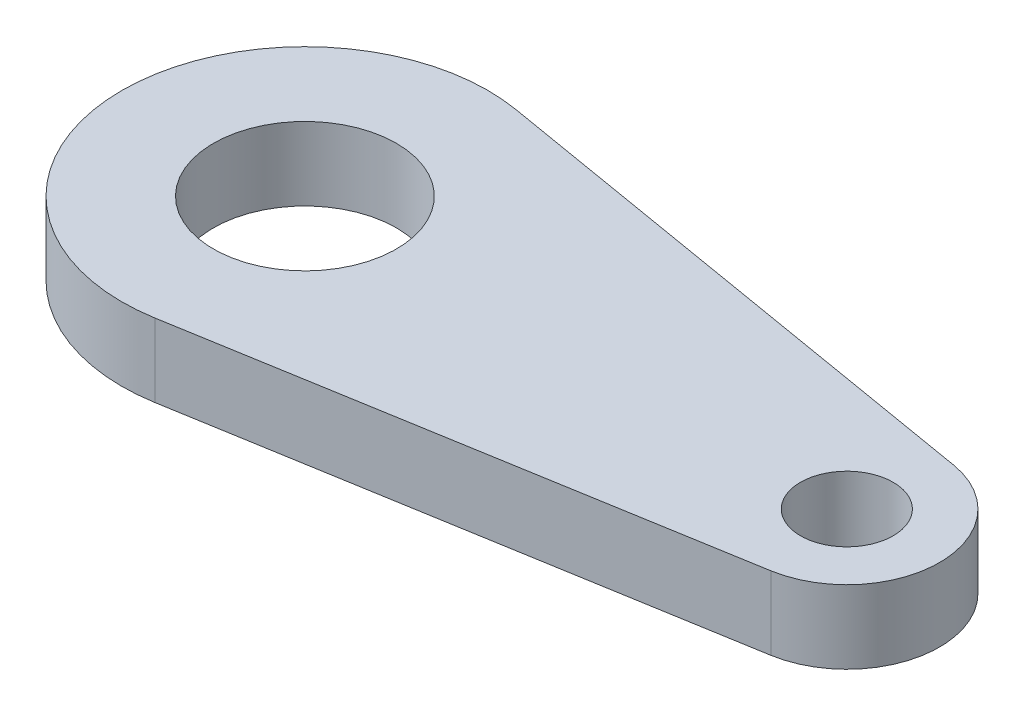
ISO-10303-21;
HEADER;
FILE_DESCRIPTION(('STEP AP214'),'2;1');
FILE_NAME('part.step','',(''),(''),'','','');
FILE_SCHEMA(('AUTOMOTIVE_DESIGN { 1 0 10303 214 1 1 1 1 }'));
ENDSEC;
DATA;
#1=APPLICATION_CONTEXT('core data for automotive mechanical design processes');
#2=APPLICATION_PROTOCOL_DEFINITION('international standard','automotive_design',2000,#1);
#3=PRODUCT_CONTEXT('',#1,'mechanical');
#4=PRODUCT('Part','Part','',(#3));
#5=PRODUCT_RELATED_PRODUCT_CATEGORY('part','',(#4));
#6=PRODUCT_DEFINITION_FORMATION('','',#4);
#7=PRODUCT_DEFINITION_CONTEXT('part definition',#1,'design');
#8=PRODUCT_DEFINITION('design','',#6,#7);
#9=PRODUCT_DEFINITION_SHAPE('','',#8);
#10=(LENGTH_UNIT() NAMED_UNIT(*) SI_UNIT(.MILLI.,.METRE.));
#11=(NAMED_UNIT(*) PLANE_ANGLE_UNIT() SI_UNIT($,.RADIAN.));
#12=(NAMED_UNIT(*) SI_UNIT($,.STERADIAN.) SOLID_ANGLE_UNIT());
#13=UNCERTAINTY_MEASURE_WITH_UNIT(LENGTH_MEASURE(1.E-05),#10,'distance_accuracy_value','');
#14=(GEOMETRIC_REPRESENTATION_CONTEXT(3) GLOBAL_UNCERTAINTY_ASSIGNED_CONTEXT((#13)) GLOBAL_UNIT_ASSIGNED_CONTEXT((#10,
#11,#12)) REPRESENTATION_CONTEXT('',''));
#15=CARTESIAN_POINT('',(0.,0.,0.));
#16=DIRECTION('',(0.,0.,1.));
#17=DIRECTION('',(1.,0.,0.));
#18=AXIS2_PLACEMENT_3D('',#15,#16,#17);
#19=CARTESIAN_POINT('',(-56.388,7.62,0.));
#20=DIRECTION('',(0.,1.,0.));
#21=DIRECTION('',(0.,0.,1.));
#22=AXIS2_PLACEMENT_3D('',#19,#20,#21);
#23=PLANE('',#22);
#24=CARTESIAN_POINT('',(-56.388,7.62,0.));
#25=DIRECTION('',(0.,1.,0.));
#26=DIRECTION('',(0.,0.,1.));
#27=AXIS2_PLACEMENT_3D('',#24,#25,#26);
#28=CIRCLE('',#27,9.525);
#29=CARTESIAN_POINT('',(-56.388,7.62,-9.525));
#30=VERTEX_POINT('',#29);
#31=EDGE_CURVE('E104',#30,#30,#28,.T.);
#32=ORIENTED_EDGE('',*,*,#31,.F.);
#33=EDGE_LOOP('',(#32));
#34=FACE_BOUND('',#33,.T.);
#35=CARTESIAN_POINT('',(-56.388,7.62,0.));
#36=DIRECTION('',(0.,1.,0.));
#37=DIRECTION('',(0.,0.,1.));
#38=AXIS2_PLACEMENT_3D('',#35,#36,#37);
#39=CIRCLE('',#38,19.05);
#40=CARTESIAN_POINT('',(-53.213,7.62,-18.7835533113413));
#41=VERTEX_POINT('',#40);
#42=CARTESIAN_POINT('',(-53.213,7.62,18.7835533113413));
#43=VERTEX_POINT('',#42);
#44=EDGE_CURVE('E89',#41,#43,#39,.T.);
#45=ORIENTED_EDGE('',*,*,#44,.T.);
#46=DIRECTION('',(0.986013297183269,0.,-0.166666666666667));
#47=VECTOR('',#46,1.);
#48=CARTESIAN_POINT('',(-53.213,7.62,18.7835533113413));
#49=LINE('',#48,#47);
#50=CARTESIAN_POINT('',(1.60866666666667,7.62,9.51700034441291));
#51=VERTEX_POINT('',#50);
#52=EDGE_CURVE('E84',#43,#51,#49,.T.);
#53=ORIENTED_EDGE('',*,*,#52,.T.);
#54=CARTESIAN_POINT('',(0.,7.62,0.));
#55=DIRECTION('',(0.,1.,0.));
#56=DIRECTION('',(0.,0.,1.));
#57=AXIS2_PLACEMENT_3D('',#54,#55,#56);
#58=CIRCLE('',#57,9.652);
#59=CARTESIAN_POINT('',(1.60866666666667,7.62,-9.51700034441291));
#60=VERTEX_POINT('',#59);
#61=EDGE_CURVE('E87',#51,#60,#58,.T.);
#62=ORIENTED_EDGE('',*,*,#61,.T.);
#63=DIRECTION('',(-0.986013297183269,0.,-0.166666666666667));
#64=VECTOR('',#63,1.);
#65=CARTESIAN_POINT('',(-53.213,7.62,-18.7835533113413));
#66=LINE('',#65,#64);
#67=EDGE_CURVE('E54',#60,#41,#66,.T.);
#68=ORIENTED_EDGE('',*,*,#67,.T.);
#69=EDGE_LOOP('',(#45,#53,#62,#68));
#70=FACE_BOUND('',#69,.T.);
#71=CARTESIAN_POINT('',(0.,7.62,0.));
#72=DIRECTION('',(0.,1.,0.));
#73=DIRECTION('',(0.,0.,1.));
#74=AXIS2_PLACEMENT_3D('',#71,#72,#73);
#75=CIRCLE('',#74,4.826);
#76=CARTESIAN_POINT('',(0.,7.62,-4.826));
#77=VERTEX_POINT('',#76);
#78=EDGE_CURVE('E119',#77,#77,#75,.T.);
#79=ORIENTED_EDGE('',*,*,#78,.F.);
#80=EDGE_LOOP('',(#79));
#81=FACE_BOUND('',#80,.T.);
#82=ADVANCED_FACE('F37',(#34,#70,#81),#23,.T.);
#83=CARTESIAN_POINT('',(-56.388,0.,0.));
#84=DIRECTION('',(0.,1.,0.));
#85=DIRECTION('',(0.,0.,1.));
#86=AXIS2_PLACEMENT_3D('',#83,#84,#85);
#87=PLANE('',#86);
#88=CARTESIAN_POINT('',(-56.388,0.,0.));
#89=DIRECTION('',(0.,1.,0.));
#90=DIRECTION('',(0.,0.,1.));
#91=AXIS2_PLACEMENT_3D('',#88,#89,#90);
#92=CIRCLE('',#91,19.05);
#93=CARTESIAN_POINT('',(-53.213,0.,-18.7835533113413));
#94=VERTEX_POINT('',#93);
#95=CARTESIAN_POINT('',(-53.213,0.,18.7835533113413));
#96=VERTEX_POINT('',#95);
#97=EDGE_CURVE('E101',#94,#96,#92,.T.);
#98=ORIENTED_EDGE('',*,*,#97,.F.);
#99=DIRECTION('',(-0.986013297183269,0.,-0.166666666666667));
#100=VECTOR('',#99,1.);
#101=CARTESIAN_POINT('',(-53.213,0.,-18.7835533113413));
#102=LINE('',#101,#100);
#103=CARTESIAN_POINT('',(1.60866666666667,0.,-9.51700034441291));
#104=VERTEX_POINT('',#103);
#105=EDGE_CURVE('E77',#104,#94,#102,.T.);
#106=ORIENTED_EDGE('',*,*,#105,.F.);
#107=CARTESIAN_POINT('',(0.,0.,0.));
#108=DIRECTION('',(0.,1.,0.));
#109=DIRECTION('',(0.,0.,1.));
#110=AXIS2_PLACEMENT_3D('',#107,#108,#109);
#111=CIRCLE('',#110,9.652);
#112=CARTESIAN_POINT('',(1.60866666666667,0.,9.51700034441291));
#113=VERTEX_POINT('',#112);
#114=EDGE_CURVE('E71',#113,#104,#111,.T.);
#115=ORIENTED_EDGE('',*,*,#114,.F.);
#116=DIRECTION('',(0.986013297183269,0.,-0.166666666666667));
#117=VECTOR('',#116,1.);
#118=CARTESIAN_POINT('',(-53.213,0.,18.7835533113413));
#119=LINE('',#118,#117);
#120=EDGE_CURVE('E93',#96,#113,#119,.T.);
#121=ORIENTED_EDGE('',*,*,#120,.F.);
#122=EDGE_LOOP('',(#98,#106,#115,#121));
#123=FACE_BOUND('',#122,.T.);
#124=CARTESIAN_POINT('',(-56.388,0.,0.));
#125=DIRECTION('',(0.,1.,0.));
#126=DIRECTION('',(0.,0.,1.));
#127=AXIS2_PLACEMENT_3D('',#124,#125,#126);
#128=CIRCLE('',#127,9.525);
#129=CARTESIAN_POINT('',(-56.388,0.,-9.525));
#130=VERTEX_POINT('',#129);
#131=EDGE_CURVE('E116',#130,#130,#128,.T.);
#132=ORIENTED_EDGE('',*,*,#131,.T.);
#133=EDGE_LOOP('',(#132));
#134=FACE_BOUND('',#133,.T.);
#135=CARTESIAN_POINT('',(0.,0.,0.));
#136=DIRECTION('',(0.,1.,0.));
#137=DIRECTION('',(0.,0.,1.));
#138=AXIS2_PLACEMENT_3D('',#135,#136,#137);
#139=CIRCLE('',#138,4.826);
#140=CARTESIAN_POINT('',(0.,0.,-4.826));
#141=VERTEX_POINT('',#140);
#142=EDGE_CURVE('E122',#141,#141,#139,.T.);
#143=ORIENTED_EDGE('',*,*,#142,.T.);
#144=EDGE_LOOP('',(#143));
#145=FACE_BOUND('',#144,.T.);
#146=ADVANCED_FACE('F112',(#123,#134,#145),#87,.F.);
#147=CARTESIAN_POINT('',(-56.388,7.62,0.));
#148=DIRECTION('',(0.,-1.,0.));
#149=DIRECTION('',(0.,0.,-1.));
#150=AXIS2_PLACEMENT_3D('',#147,#148,#149);
#151=CYLINDRICAL_SURFACE('',#150,19.05);
#152=ORIENTED_EDGE('',*,*,#97,.T.);
#153=DIRECTION('',(0.,-1.,0.));
#154=VECTOR('',#153,1.);
#155=CARTESIAN_POINT('',(-53.213,7.62,18.7835533113413));
#156=LINE('',#155,#154);
#157=EDGE_CURVE('E11',#43,#96,#156,.T.);
#158=ORIENTED_EDGE('',*,*,#157,.F.);
#159=ORIENTED_EDGE('',*,*,#44,.F.);
#160=DIRECTION('',(0.,-1.,0.));
#161=VECTOR('',#160,1.);
#162=CARTESIAN_POINT('',(-53.213,7.62,-18.7835533113413));
#163=LINE('',#162,#161);
#164=EDGE_CURVE('E97',#41,#94,#163,.T.);
#165=ORIENTED_EDGE('',*,*,#164,.T.);
#166=EDGE_LOOP('',(#152,#158,#159,#165));
#167=FACE_BOUND('',#166,.T.);
#168=ADVANCED_FACE('F39',(#167),#151,.T.);
#169=CARTESIAN_POINT('',(-53.213,7.62,18.7835533113413));
#170=DIRECTION('',(-0.166666666666667,0.,-0.986013297183269));
#171=DIRECTION('',(-0.986013297183269,0.,0.166666666666667));
#172=AXIS2_PLACEMENT_3D('',#169,#170,#171);
#173=PLANE('',#172);
#174=ORIENTED_EDGE('',*,*,#120,.T.);
#175=DIRECTION('',(0.,-1.,0.));
#176=VECTOR('',#175,1.);
#177=CARTESIAN_POINT('',(1.60866666666667,7.62,9.51700034441291));
#178=LINE('',#177,#176);
#179=EDGE_CURVE('E46',#51,#113,#178,.T.);
#180=ORIENTED_EDGE('',*,*,#179,.F.);
#181=ORIENTED_EDGE('',*,*,#52,.F.);
#182=ORIENTED_EDGE('',*,*,#157,.T.);
#183=EDGE_LOOP('',(#174,#180,#181,#182));
#184=FACE_BOUND('',#183,.T.);
#185=ADVANCED_FACE('F92',(#184),#173,.F.);
#186=CARTESIAN_POINT('',(0.,7.62,0.));
#187=DIRECTION('',(0.,-1.,0.));
#188=DIRECTION('',(0.,0.,-1.));
#189=AXIS2_PLACEMENT_3D('',#186,#187,#188);
#190=CYLINDRICAL_SURFACE('',#189,9.652);
#191=ORIENTED_EDGE('',*,*,#114,.T.);
#192=DIRECTION('',(0.,-1.,0.));
#193=VECTOR('',#192,1.);
#194=CARTESIAN_POINT('',(1.60866666666667,7.62,-9.51700034441291));
#195=LINE('',#194,#193);
#196=EDGE_CURVE('E94',#60,#104,#195,.T.);
#197=ORIENTED_EDGE('',*,*,#196,.F.);
#198=ORIENTED_EDGE('',*,*,#61,.F.);
#199=ORIENTED_EDGE('',*,*,#179,.T.);
#200=EDGE_LOOP('',(#191,#197,#198,#199));
#201=FACE_BOUND('',#200,.T.);
#202=ADVANCED_FACE('F95',(#201),#190,.T.);
#203=CARTESIAN_POINT('',(-53.213,7.62,-18.7835533113413));
#204=DIRECTION('',(-0.166666666666667,0.,0.986013297183269));
#205=DIRECTION('',(0.986013297183269,0.,0.166666666666667));
#206=AXIS2_PLACEMENT_3D('',#203,#204,#205);
#207=PLANE('',#206);
#208=ORIENTED_EDGE('',*,*,#105,.T.);
#209=ORIENTED_EDGE('',*,*,#164,.F.);
#210=ORIENTED_EDGE('',*,*,#67,.F.);
#211=ORIENTED_EDGE('',*,*,#196,.T.);
#212=EDGE_LOOP('',(#208,#209,#210,#211));
#213=FACE_BOUND('',#212,.T.);
#214=ADVANCED_FACE('F109',(#213),#207,.F.);
#215=CARTESIAN_POINT('',(-56.388,7.62,0.));
#216=DIRECTION('',(0.,-1.,0.));
#217=DIRECTION('',(0.,0.,-1.));
#218=AXIS2_PLACEMENT_3D('',#215,#216,#217);
#219=CYLINDRICAL_SURFACE('',#218,9.525);
#220=CARTESIAN_POINT('',(-56.388,7.62,-9.525));
#221=CARTESIAN_POINT('',(-56.388,7.540625,-9.525));
#222=CARTESIAN_POINT('',(-56.388,7.46125,-9.525));
#223=CARTESIAN_POINT('',(-56.388,7.3025,-9.525));
#224=CARTESIAN_POINT('',(-56.388,7.223125,-9.525));
#225=CARTESIAN_POINT('',(-56.388,7.064375,-9.525));
#226=CARTESIAN_POINT('',(-56.388,6.985,-9.525));
#227=CARTESIAN_POINT('',(-56.388,6.82625,-9.525));
#228=CARTESIAN_POINT('',(-56.388,6.746875,-9.525));
#229=CARTESIAN_POINT('',(-56.388,6.588125,-9.525));
#230=CARTESIAN_POINT('',(-56.388,6.50875,-9.525));
#231=CARTESIAN_POINT('',(-56.388,6.35,-9.525));
#232=CARTESIAN_POINT('',(-56.388,6.270625,-9.525));
#233=CARTESIAN_POINT('',(-56.388,6.111875,-9.525));
#234=CARTESIAN_POINT('',(-56.388,6.0325,-9.525));
#235=CARTESIAN_POINT('',(-56.388,5.87375,-9.525));
#236=CARTESIAN_POINT('',(-56.388,5.794375,-9.525));
#237=CARTESIAN_POINT('',(-56.388,5.635625,-9.525));
#238=CARTESIAN_POINT('',(-56.388,5.55625,-9.525));
#239=CARTESIAN_POINT('',(-56.388,5.3975,-9.525));
#240=CARTESIAN_POINT('',(-56.388,5.318125,-9.525));
#241=CARTESIAN_POINT('',(-56.388,5.159375,-9.525));
#242=CARTESIAN_POINT('',(-56.388,5.08,-9.525));
#243=CARTESIAN_POINT('',(-56.388,4.92125,-9.525));
#244=CARTESIAN_POINT('',(-56.388,4.841875,-9.525));
#245=CARTESIAN_POINT('',(-56.388,4.683125,-9.525));
#246=CARTESIAN_POINT('',(-56.388,4.60375,-9.525));
#247=CARTESIAN_POINT('',(-56.388,4.445,-9.525));
#248=CARTESIAN_POINT('',(-56.388,4.365625,-9.525));
#249=CARTESIAN_POINT('',(-56.388,4.206875,-9.525));
#250=CARTESIAN_POINT('',(-56.388,4.1275,-9.525));
#251=CARTESIAN_POINT('',(-56.388,3.96875,-9.525));
#252=CARTESIAN_POINT('',(-56.388,3.889375,-9.525));
#253=CARTESIAN_POINT('',(-56.388,3.730625,-9.525));
#254=CARTESIAN_POINT('',(-56.388,3.65125,-9.525));
#255=CARTESIAN_POINT('',(-56.388,3.4925,-9.525));
#256=CARTESIAN_POINT('',(-56.388,3.413125,-9.525));
#257=CARTESIAN_POINT('',(-56.388,3.254375,-9.525));
#258=CARTESIAN_POINT('',(-56.388,3.175,-9.525));
#259=CARTESIAN_POINT('',(-56.388,3.01625,-9.525));
#260=CARTESIAN_POINT('',(-56.388,2.936875,-9.525));
#261=CARTESIAN_POINT('',(-56.388,2.778125,-9.525));
#262=CARTESIAN_POINT('',(-56.388,2.69875,-9.525));
#263=CARTESIAN_POINT('',(-56.388,2.54,-9.525));
#264=CARTESIAN_POINT('',(-56.388,2.460625,-9.525));
#265=CARTESIAN_POINT('',(-56.388,2.301875,-9.525));
#266=CARTESIAN_POINT('',(-56.388,2.2225,-9.525));
#267=CARTESIAN_POINT('',(-56.388,2.06375,-9.525));
#268=CARTESIAN_POINT('',(-56.388,1.984375,-9.525));
#269=CARTESIAN_POINT('',(-56.388,1.825625,-9.525));
#270=CARTESIAN_POINT('',(-56.388,1.74625,-9.525));
#271=CARTESIAN_POINT('',(-56.388,1.5875,-9.525));
#272=CARTESIAN_POINT('',(-56.388,1.508125,-9.525));
#273=CARTESIAN_POINT('',(-56.388,1.349375,-9.525));
#274=CARTESIAN_POINT('',(-56.388,1.27,-9.525));
#275=CARTESIAN_POINT('',(-56.388,1.11125,-9.525));
#276=CARTESIAN_POINT('',(-56.388,1.031875,-9.525));
#277=CARTESIAN_POINT('',(-56.388,0.873125,-9.525));
#278=CARTESIAN_POINT('',(-56.388,0.79375,-9.525));
#279=CARTESIAN_POINT('',(-56.388,0.635,-9.525));
#280=CARTESIAN_POINT('',(-56.388,0.555625,-9.525));
#281=CARTESIAN_POINT('',(-56.388,0.396875,-9.525));
#282=CARTESIAN_POINT('',(-56.388,0.3175,-9.525));
#283=CARTESIAN_POINT('',(-56.388,0.15875,-9.525));
#284=CARTESIAN_POINT('',(-56.388,0.0793749999999999,-9.525));
#285=CARTESIAN_POINT('',(-56.388,0.,-9.525));
#286=B_SPLINE_CURVE_WITH_KNOTS('',3,(#220,#221,#222,#223,#224,#225,#226,#227,#228,#229,#230,
#231,#232,#233,#234,#235,#236,#237,#238,#239,#240,#241,#242,#243,#244,#245,#246,#247,#248,#249,
#250,#251,#252,#253,#254,#255,#256,#257,#258,#259,#260,#261,#262,#263,#264,#265,#266,#267,#268,
#269,#270,#271,#272,#273,#274,#275,#276,#277,#278,#279,#280,#281,#282,#283,#284,#285),
.UNSPECIFIED.,.F.,.F.,(4,2,2,2,2,2,2,2,2,2,2,2,2,2,2,2,2,2,2,2,2,2,2,2,2,2,2,2,2,2,2,2,4),(0.,
0.238125,0.476249999999999,0.714375,0.952499999999999,1.190625,1.42875,1.666875,1.905,2.143125,
2.38125,2.619375,2.8575,3.095625,3.33375,3.571875,3.81,4.048125,4.28625,4.524375,4.7625,
5.000625,5.23875,5.476875,5.715,5.953125,6.19125,6.429375,6.6675,6.905625,7.14375,7.381875,
7.62),.UNSPECIFIED.);
#287=EDGE_CURVE('BSEAM139',#30,#130,#286,.T.);
#288=ORIENTED_EDGE('',*,*,#31,.T.);
#289=ORIENTED_EDGE('',*,*,#131,.F.);
#290=ORIENTED_EDGE('',*,*,#287,.T.);
#291=ORIENTED_EDGE('',*,*,#287,.F.);
#292=EDGE_LOOP('',(#288,#290,#289,#291));
#293=FACE_BOUND('',#292,.T.);
#294=ADVANCED_FACE('F139',(#293),#219,.F.);
#295=CARTESIAN_POINT('',(0.,7.62,0.));
#296=DIRECTION('',(0.,-1.,0.));
#297=DIRECTION('',(0.,0.,-1.));
#298=AXIS2_PLACEMENT_3D('',#295,#296,#297);
#299=CYLINDRICAL_SURFACE('',#298,4.826);
#300=CARTESIAN_POINT('',(0.,7.62,-4.826));
#301=CARTESIAN_POINT('',(0.,7.540625,-4.826));
#302=CARTESIAN_POINT('',(0.,7.46125,-4.826));
#303=CARTESIAN_POINT('',(0.,7.3025,-4.826));
#304=CARTESIAN_POINT('',(0.,7.223125,-4.826));
#305=CARTESIAN_POINT('',(0.,7.064375,-4.826));
#306=CARTESIAN_POINT('',(0.,6.985,-4.826));
#307=CARTESIAN_POINT('',(0.,6.82625,-4.826));
#308=CARTESIAN_POINT('',(0.,6.746875,-4.826));
#309=CARTESIAN_POINT('',(0.,6.588125,-4.826));
#310=CARTESIAN_POINT('',(0.,6.50875,-4.826));
#311=CARTESIAN_POINT('',(0.,6.35,-4.826));
#312=CARTESIAN_POINT('',(0.,6.270625,-4.826));
#313=CARTESIAN_POINT('',(0.,6.111875,-4.826));
#314=CARTESIAN_POINT('',(0.,6.0325,-4.826));
#315=CARTESIAN_POINT('',(0.,5.87375,-4.826));
#316=CARTESIAN_POINT('',(0.,5.794375,-4.826));
#317=CARTESIAN_POINT('',(0.,5.635625,-4.826));
#318=CARTESIAN_POINT('',(0.,5.55625,-4.826));
#319=CARTESIAN_POINT('',(0.,5.3975,-4.826));
#320=CARTESIAN_POINT('',(0.,5.318125,-4.826));
#321=CARTESIAN_POINT('',(0.,5.159375,-4.826));
#322=CARTESIAN_POINT('',(0.,5.08,-4.826));
#323=CARTESIAN_POINT('',(0.,4.92125,-4.826));
#324=CARTESIAN_POINT('',(0.,4.841875,-4.826));
#325=CARTESIAN_POINT('',(0.,4.683125,-4.826));
#326=CARTESIAN_POINT('',(0.,4.60375,-4.826));
#327=CARTESIAN_POINT('',(0.,4.445,-4.826));
#328=CARTESIAN_POINT('',(0.,4.365625,-4.826));
#329=CARTESIAN_POINT('',(0.,4.206875,-4.826));
#330=CARTESIAN_POINT('',(0.,4.1275,-4.826));
#331=CARTESIAN_POINT('',(0.,3.96875,-4.826));
#332=CARTESIAN_POINT('',(0.,3.889375,-4.826));
#333=CARTESIAN_POINT('',(0.,3.730625,-4.826));
#334=CARTESIAN_POINT('',(0.,3.65125,-4.826));
#335=CARTESIAN_POINT('',(0.,3.4925,-4.826));
#336=CARTESIAN_POINT('',(0.,3.413125,-4.826));
#337=CARTESIAN_POINT('',(0.,3.254375,-4.826));
#338=CARTESIAN_POINT('',(0.,3.175,-4.826));
#339=CARTESIAN_POINT('',(0.,3.01625,-4.826));
#340=CARTESIAN_POINT('',(0.,2.936875,-4.826));
#341=CARTESIAN_POINT('',(0.,2.778125,-4.826));
#342=CARTESIAN_POINT('',(0.,2.69875,-4.826));
#343=CARTESIAN_POINT('',(0.,2.54,-4.826));
#344=CARTESIAN_POINT('',(0.,2.460625,-4.826));
#345=CARTESIAN_POINT('',(0.,2.301875,-4.826));
#346=CARTESIAN_POINT('',(0.,2.2225,-4.826));
#347=CARTESIAN_POINT('',(0.,2.06375,-4.826));
#348=CARTESIAN_POINT('',(0.,1.984375,-4.826));
#349=CARTESIAN_POINT('',(0.,1.825625,-4.826));
#350=CARTESIAN_POINT('',(0.,1.74625,-4.826));
#351=CARTESIAN_POINT('',(0.,1.5875,-4.826));
#352=CARTESIAN_POINT('',(0.,1.508125,-4.826));
#353=CARTESIAN_POINT('',(0.,1.349375,-4.826));
#354=CARTESIAN_POINT('',(0.,1.27,-4.826));
#355=CARTESIAN_POINT('',(0.,1.11125,-4.826));
#356=CARTESIAN_POINT('',(0.,1.031875,-4.826));
#357=CARTESIAN_POINT('',(0.,0.873125,-4.826));
#358=CARTESIAN_POINT('',(0.,0.79375,-4.826));
#359=CARTESIAN_POINT('',(0.,0.635,-4.826));
#360=CARTESIAN_POINT('',(0.,0.555625,-4.826));
#361=CARTESIAN_POINT('',(0.,0.396875,-4.826));
#362=CARTESIAN_POINT('',(0.,0.3175,-4.826));
#363=CARTESIAN_POINT('',(0.,0.15875,-4.826));
#364=CARTESIAN_POINT('',(0.,0.0793749999999999,-4.826));
#365=CARTESIAN_POINT('',(0.,0.,-4.826));
#366=B_SPLINE_CURVE_WITH_KNOTS('',3,(#300,#301,#302,#303,#304,#305,#306,#307,#308,#309,#310,
#311,#312,#313,#314,#315,#316,#317,#318,#319,#320,#321,#322,#323,#324,#325,#326,#327,#328,#329,
#330,#331,#332,#333,#334,#335,#336,#337,#338,#339,#340,#341,#342,#343,#344,#345,#346,#347,#348,
#349,#350,#351,#352,#353,#354,#355,#356,#357,#358,#359,#360,#361,#362,#363,#364,#365),
.UNSPECIFIED.,.F.,.F.,(4,2,2,2,2,2,2,2,2,2,2,2,2,2,2,2,2,2,2,2,2,2,2,2,2,2,2,2,2,2,2,2,4),(0.,
0.238125,0.47625,0.714375000000001,0.9525,1.190625,1.42875,1.666875,1.905,2.143125,2.38125,
2.619375,2.8575,3.095625,3.33375,3.571875,3.81,4.048125,4.28625,4.524375,4.7625,5.000625,
5.23875,5.476875,5.715,5.953125,6.19125,6.429375,6.6675,6.905625,7.14375,7.381875,7.62),.UNSPECIFIED.);
#367=EDGE_CURVE('BSEAM128',#77,#141,#366,.T.);
#368=ORIENTED_EDGE('',*,*,#78,.T.);
#369=ORIENTED_EDGE('',*,*,#142,.F.);
#370=ORIENTED_EDGE('',*,*,#367,.T.);
#371=ORIENTED_EDGE('',*,*,#367,.F.);
#372=EDGE_LOOP('',(#368,#370,#369,#371));
#373=FACE_BOUND('',#372,.T.);
#374=ADVANCED_FACE('F128',(#373),#299,.F.);
#375=CLOSED_SHELL('',(#82,#146,#168,#185,#202,#214,#294,#374));
#376=MANIFOLD_SOLID_BREP('B2',#375);
#377=ADVANCED_BREP_SHAPE_REPRESENTATION('',(#18,#376),#14);
#378=SHAPE_DEFINITION_REPRESENTATION(#9,#377);
ENDSEC;
END-ISO-10303-21;
